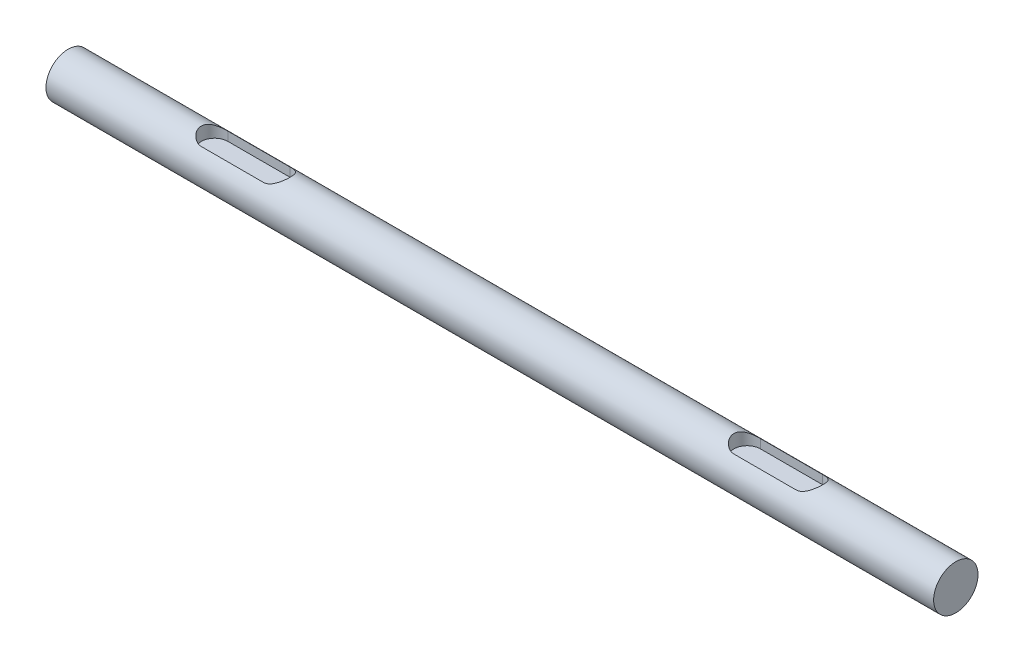
ISO-10303-21;
HEADER;
FILE_DESCRIPTION(('STEP AP214'),'2;1');
FILE_NAME('part.step','',(''),(''),'','','');
FILE_SCHEMA(('AUTOMOTIVE_DESIGN { 1 0 10303 214 1 1 1 1 }'));
ENDSEC;
DATA;
#1=APPLICATION_CONTEXT('core data for automotive mechanical design processes');
#2=APPLICATION_PROTOCOL_DEFINITION('international standard','automotive_design',2000,#1);
#3=PRODUCT_CONTEXT('',#1,'mechanical');
#4=PRODUCT('Part','Part','',(#3));
#5=PRODUCT_RELATED_PRODUCT_CATEGORY('part','',(#4));
#6=PRODUCT_DEFINITION_FORMATION('','',#4);
#7=PRODUCT_DEFINITION_CONTEXT('part definition',#1,'design');
#8=PRODUCT_DEFINITION('design','',#6,#7);
#9=PRODUCT_DEFINITION_SHAPE('','',#8);
#10=(LENGTH_UNIT() NAMED_UNIT(*) SI_UNIT(.MILLI.,.METRE.));
#11=(NAMED_UNIT(*) PLANE_ANGLE_UNIT() SI_UNIT($,.RADIAN.));
#12=(NAMED_UNIT(*) SI_UNIT($,.STERADIAN.) SOLID_ANGLE_UNIT());
#13=UNCERTAINTY_MEASURE_WITH_UNIT(LENGTH_MEASURE(1.E-05),#10,'distance_accuracy_value','');
#14=(GEOMETRIC_REPRESENTATION_CONTEXT(3) GLOBAL_UNCERTAINTY_ASSIGNED_CONTEXT((#13)) GLOBAL_UNIT_ASSIGNED_CONTEXT((#10,
#11,#12)) REPRESENTATION_CONTEXT('',''));
#15=CARTESIAN_POINT('',(0.,0.,0.));
#16=DIRECTION('',(0.,0.,1.));
#17=DIRECTION('',(1.,0.,0.));
#18=AXIS2_PLACEMENT_3D('',#15,#16,#17);
#19=CARTESIAN_POINT('',(100.,0.,0.));
#20=DIRECTION('',(-1.,0.,0.));
#21=DIRECTION('',(0.,0.,1.));
#22=AXIS2_PLACEMENT_3D('',#19,#20,#21);
#23=CYLINDRICAL_SURFACE('',#22,5.);
#24=DIRECTION('',(-1.,0.,0.));
#25=VECTOR('',#24,1.);
#26=CARTESIAN_POINT('',(100.,4.,-3.));
#27=LINE('',#26,#25);
#28=CARTESIAN_POINT('',(153.,4.,-3.));
#29=VERTEX_POINT('',#28);
#30=CARTESIAN_POINT('',(167.,4.,-3.));
#31=VERTEX_POINT('',#30);
#32=EDGE_CURVE('E11',#29,#31,#27,.F.);
#33=ORIENTED_EDGE('',*,*,#32,.T.);
#34=CARTESIAN_POINT('',(167.,4.,-3.));
#35=CARTESIAN_POINT('',(167.075871977817,3.99996787232582,-3.00001692537307));
#36=CARTESIAN_POINT('',(167.151725077901,4.00215786299425,-2.99712241547426));
#37=CARTESIAN_POINT('',(167.302688776043,4.01073748214672,-2.98564518053647));
#38=CARTESIAN_POINT('',(167.377800025514,4.01712301686455,-2.97706800024637));
#39=CARTESIAN_POINT('',(167.526129669188,4.03378307190143,-2.95445046977405));
#40=CARTESIAN_POINT('',(167.599358401018,4.04402606066036,-2.94045438932729));
#41=CARTESIAN_POINT('',(167.744028472743,4.06798283405872,-2.90722136348392));
#42=CARTESIAN_POINT('',(167.815469450417,4.0816973159079,-2.88798336524856));
#43=CARTESIAN_POINT('',(168.025929700044,4.12720949885208,-2.82293145826831));
#44=CARTESIAN_POINT('',(168.161761179177,4.16345930010657,-2.76967363516868));
#45=CARTESIAN_POINT('',(168.422652508669,4.24363256758644,-2.64519536397735));
#46=CARTESIAN_POINT('',(168.547687033726,4.28757338079437,-2.57393414481209));
#47=CARTESIAN_POINT('',(168.799917073737,4.38458187114304,-2.40540739276783));
#48=CARTESIAN_POINT('',(168.925532839025,4.43810998768875,-2.30603538494308));
#49=CARTESIAN_POINT('',(169.159570971129,4.54454402644165,-2.08849836637958));
#50=CARTESIAN_POINT('',(169.267987155479,4.59744971861747,-1.97032662842434));
#51=CARTESIAN_POINT('',(169.476278477957,4.70351635584216,-1.70284992270619));
#52=CARTESIAN_POINT('',(169.573960722109,4.75608571502877,-1.55155989155465));
#53=CARTESIAN_POINT('',(169.699741060205,4.82570253754456,-1.31133584893004));
#54=CARTESIAN_POINT('',(169.738220009195,4.84737427703644,-1.22901675253548));
#55=CARTESIAN_POINT('',(169.807789197253,4.8870090175708,-1.06047705712918));
#56=CARTESIAN_POINT('',(169.838884323908,4.90497447088308,-0.97425908416188));
#57=CARTESIAN_POINT('',(169.890627441134,4.93511192382809,-0.806968111144921));
#58=CARTESIAN_POINT('',(169.911987226586,4.94767213737429,-0.726184333286257));
#59=CARTESIAN_POINT('',(169.947949890093,4.96892319630847,-0.562666702523373));
#60=CARTESIAN_POINT('',(169.962556533415,4.97761619778881,-0.47993396338821));
#61=CARTESIAN_POINT('',(169.98478464018,4.99087752212245,-0.313245067395166));
#62=CARTESIAN_POINT('',(169.992409816133,4.99544803715671,-0.229289584910372));
#63=CARTESIAN_POINT('',(170.000566639965,5.00033941568446,-0.0609399693770785));
#64=CARTESIAN_POINT('',(170.001099009538,5.00066071153612,0.0234541181691588));
#65=CARTESIAN_POINT('',(169.992757198311,4.99565269254161,0.255171482719188));
#66=CARTESIAN_POINT('',(169.976528740899,4.98590474727508,0.402220564293291));
#67=CARTESIAN_POINT('',(169.923044400639,4.95416382666838,0.690956802633995));
#68=CARTESIAN_POINT('',(169.885787045797,4.93216999413411,0.832643583305859));
#69=CARTESIAN_POINT('',(169.791666925357,4.87769664946882,1.10810810538676));
#70=CARTESIAN_POINT('',(169.73469132452,4.8451568590039,1.24183502003438));
#71=CARTESIAN_POINT('',(169.603229553725,4.77219201218867,1.49798262201563));
#72=CARTESIAN_POINT('',(169.528739335702,4.73176513330436,1.62040068646818));
#73=CARTESIAN_POINT('',(169.354330852636,4.64076401053393,1.86613229963391));
#74=CARTESIAN_POINT('',(169.252439060816,4.58955455185811,1.98780984018437));
#75=CARTESIAN_POINT('',(169.031232566685,4.4851268486321,2.21339922400098));
#76=CARTESIAN_POINT('',(168.911889920185,4.43190548570084,2.31728198187349));
#77=CARTESIAN_POINT('',(168.642532023949,4.322164352034,2.51659971990669));
#78=CARTESIAN_POINT('',(168.490562671568,4.26598422797724,2.60963495464279));
#79=CARTESIAN_POINT('',(168.250228852194,4.1901448347924,2.72853585268934));
#80=CARTESIAN_POINT('',(168.168139587669,4.16628916905458,2.76470247721434));
#81=CARTESIAN_POINT('',(168.000188799264,4.12235655723054,2.82979053218025));
#82=CARTESIAN_POINT('',(167.914330437192,4.10227651585107,2.85871790392669));
#83=CARTESIAN_POINT('',(167.760808411581,4.07119612829703,2.90274028553152));
#84=CARTESIAN_POINT('',(167.693819454351,4.05917589940332,2.91948814079959));
#85=CARTESIAN_POINT('',(167.558393194759,4.03823334849025,2.94838741026761));
#86=CARTESIAN_POINT('',(167.489956377868,4.02931000501335,2.96054034014788));
#87=CARTESIAN_POINT('',(167.351576219637,4.01482929660031,2.98015179379349));
#88=CARTESIAN_POINT('',(167.281625795797,4.00929524901473,2.98757781123641));
#89=CARTESIAN_POINT('',(167.14112148518,4.00186666189432,2.99751072442895));
#90=CARTESIAN_POINT('',(167.070567101116,3.99997548544344,3.00001307471461));
#91=CARTESIAN_POINT('',(167.,4.,3.));
#92=B_SPLINE_CURVE_WITH_KNOTS('',3,(#34,#35,#36,#37,#38,#39,#40,#41,#42,#43,#44,#45,#46,#47,#48,
#49,#50,#51,#52,#53,#54,#55,#56,#57,#58,#59,#60,#61,#62,#63,#64,#65,#66,#67,#68,#69,#70,#71,#72,
#73,#74,#75,#76,#77,#78,#79,#80,#81,#82,#83,#84,#85,#86,#87,#88,#89,#90,#91),.UNSPECIFIED.,.F.,
.F.,(4,2,2,2,2,2,2,2,2,2,2,2,2,2,2,2,2,2,2,2,2,2,2,2,2,2,2,2,4),(0.,0.227498555850956,
0.454775460929315,0.680233524310966,0.905736904347167,1.35470516337815,1.80469943008075,
2.30931246709202,2.81410648055543,3.3735112951261,3.65339988736763,3.93310269272289,
4.18623678333959,4.43922956632183,4.69208773794771,4.94492018104927,5.38737462629133,
5.82986004658814,6.27492058766906,6.7200840946005,7.2183638704073,7.7174504652549,
8.27476706024813,8.55288821458628,8.83078035880876,9.04083694509353,9.25082418161798,
9.46224029964897,9.67385150282048),.UNSPECIFIED.);
#93=CARTESIAN_POINT('',(167.,4.,3.));
#94=VERTEX_POINT('',#93);
#95=EDGE_CURVE('E249',#31,#94,#92,.T.);
#96=ORIENTED_EDGE('',*,*,#95,.T.);
#97=DIRECTION('',(-1.,0.,0.));
#98=VECTOR('',#97,1.);
#99=CARTESIAN_POINT('',(100.,4.,3.));
#100=LINE('',#99,#98);
#101=CARTESIAN_POINT('',(153.,4.,3.));
#102=VERTEX_POINT('',#101);
#103=EDGE_CURVE('E52',#94,#102,#100,.T.);
#104=ORIENTED_EDGE('',*,*,#103,.T.);
#105=CARTESIAN_POINT('',(153.,4.,3.));
#106=CARTESIAN_POINT('',(152.924128022183,3.99996787232582,3.00001692537307));
#107=CARTESIAN_POINT('',(152.848274922099,4.00215786299426,2.99712241547426));
#108=CARTESIAN_POINT('',(152.697311223957,4.01073748214673,2.98564518053647));
#109=CARTESIAN_POINT('',(152.622199974486,4.01712301686455,2.97706800024636));
#110=CARTESIAN_POINT('',(152.473870330812,4.03378307190143,2.95445046977405));
#111=CARTESIAN_POINT('',(152.400641598982,4.04402606066036,2.9404543893273));
#112=CARTESIAN_POINT('',(152.255971527257,4.06798283405872,2.90722136348392));
#113=CARTESIAN_POINT('',(152.184530549583,4.0816973159079,2.88798336524856));
#114=CARTESIAN_POINT('',(151.974070299956,4.12720949885208,2.8229314582683));
#115=CARTESIAN_POINT('',(151.838238820823,4.16345930010658,2.76967363516867));
#116=CARTESIAN_POINT('',(151.577347491331,4.24363256758645,2.64519536397734));
#117=CARTESIAN_POINT('',(151.452312966274,4.28757338079437,2.57393414481208));
#118=CARTESIAN_POINT('',(151.200082926263,4.38458187114304,2.40540739276782));
#119=CARTESIAN_POINT('',(151.074467160975,4.43810998768876,2.30603538494308));
#120=CARTESIAN_POINT('',(150.840429028871,4.54454402644165,2.08849836637957));
#121=CARTESIAN_POINT('',(150.732012844521,4.59744971861747,1.97032662842434));
#122=CARTESIAN_POINT('',(150.523721522043,4.70351635584216,1.70284992270619));
#123=CARTESIAN_POINT('',(150.426039277891,4.75608571502877,1.55155989155465));
#124=CARTESIAN_POINT('',(150.300258939795,4.82570253754456,1.31133584893005));
#125=CARTESIAN_POINT('',(150.261779990805,4.84737427703644,1.22901675253549));
#126=CARTESIAN_POINT('',(150.192210802747,4.8870090175708,1.06047705712919));
#127=CARTESIAN_POINT('',(150.161115676092,4.90497447088308,0.974259084161883));
#128=CARTESIAN_POINT('',(150.109372558866,4.93511192382809,0.806968111144922));
#129=CARTESIAN_POINT('',(150.088012773414,4.94767213737429,0.72618433328626));
#130=CARTESIAN_POINT('',(150.052050109907,4.96892319630847,0.562666702523376));
#131=CARTESIAN_POINT('',(150.037443466585,4.97761619778881,0.479933963388211));
#132=CARTESIAN_POINT('',(150.01521535982,4.99087752212245,0.313245067395167));
#133=CARTESIAN_POINT('',(150.007590183867,4.99544803715671,0.229289584910374));
#134=CARTESIAN_POINT('',(149.999433360035,5.00033941568446,0.060939969377081));
#135=CARTESIAN_POINT('',(149.998900990462,5.00066071153612,-0.0234541181691576));
#136=CARTESIAN_POINT('',(150.007242801689,4.9956526925416,-0.25517148271919));
#137=CARTESIAN_POINT('',(150.023471259101,4.98590474727508,-0.402220564293295));
#138=CARTESIAN_POINT('',(150.076955599361,4.95416382666838,-0.690956802633998));
#139=CARTESIAN_POINT('',(150.114212954203,4.93216999413411,-0.832643583305861));
#140=CARTESIAN_POINT('',(150.208333074643,4.87769664946882,-1.10810810538676));
#141=CARTESIAN_POINT('',(150.26530867548,4.8451568590039,-1.24183502003437));
#142=CARTESIAN_POINT('',(150.396770446275,4.77219201218867,-1.49798262201562));
#143=CARTESIAN_POINT('',(150.471260664298,4.73176513330436,-1.62040068646818));
#144=CARTESIAN_POINT('',(150.645669147364,4.64076401053392,-1.86613229963392));
#145=CARTESIAN_POINT('',(150.747560939184,4.5895545518581,-1.98780984018438));
#146=CARTESIAN_POINT('',(150.968767433315,4.48512684863209,-2.21339922400099));
#147=CARTESIAN_POINT('',(151.088110079815,4.43190548570084,-2.31728198187349));
#148=CARTESIAN_POINT('',(151.357467976051,4.322164352034,-2.5165997199067));
#149=CARTESIAN_POINT('',(151.509437328432,4.26598422797724,-2.60963495464279));
#150=CARTESIAN_POINT('',(151.749771147806,4.1901448347924,-2.72853585268934));
#151=CARTESIAN_POINT('',(151.831860412331,4.16628916905457,-2.76470247721434));
#152=CARTESIAN_POINT('',(151.999811200736,4.12235655723054,-2.82979053218025));
#153=CARTESIAN_POINT('',(152.085669562808,4.10227651585107,-2.85871790392669));
#154=CARTESIAN_POINT('',(152.239191588419,4.07119612829704,-2.90274028553151));
#155=CARTESIAN_POINT('',(152.306180545649,4.05917589940332,-2.91948814079957));
#156=CARTESIAN_POINT('',(152.441606805241,4.03823334849026,-2.9483874102676));
#157=CARTESIAN_POINT('',(152.510043622132,4.02931000501335,-2.96054034014788));
#158=CARTESIAN_POINT('',(152.648423780363,4.01482929660031,-2.98015179379349));
#159=CARTESIAN_POINT('',(152.718374204203,4.00929524901473,-2.98757781123641));
#160=CARTESIAN_POINT('',(152.85887851482,4.00186666189432,-2.99751072442895));
#161=CARTESIAN_POINT('',(152.929432898884,3.99997548544344,-3.00001307471461));
#162=CARTESIAN_POINT('',(153.,4.,-3.));
#163=B_SPLINE_CURVE_WITH_KNOTS('',3,(#105,#106,#107,#108,#109,#110,#111,#112,#113,#114,#115,
#116,#117,#118,#119,#120,#121,#122,#123,#124,#125,#126,#127,#128,#129,#130,#131,#132,#133,#134,
#135,#136,#137,#138,#139,#140,#141,#142,#143,#144,#145,#146,#147,#148,#149,#150,#151,#152,#153,
#154,#155,#156,#157,#158,#159,#160,#161,#162),.UNSPECIFIED.,.F.,.F.,(4,2,2,2,2,2,2,2,2,2,2,2,2,
2,2,2,2,2,2,2,2,2,2,2,2,2,2,2,4),(0.,0.227498555850984,0.454775460929315,0.680233524310937,
0.905736904347166,1.35470516337824,1.80469943008075,2.30931246709202,2.81410648055543,
3.3735112951261,3.65339988736762,3.93310269272289,4.18623678333959,4.43922956632184,
4.69208773794771,4.94492018104927,5.38737462629133,5.82986004658814,6.27492058766905,
6.7200840946005,7.21836387040733,7.71745046525489,8.27476706024813,8.55288821458631,
8.83078035880876,9.04083694509344,9.25082418161798,9.46224029964895,9.67385150282049),.UNSPECIFIED.);
#164=EDGE_CURVE('E59',#102,#29,#163,.T.);
#165=ORIENTED_EDGE('',*,*,#164,.T.);
#166=EDGE_LOOP('',(#33,#96,#104,#165));
#167=FACE_BOUND('',#166,.T.);
#168=DIRECTION('',(-1.,0.,0.));
#169=VECTOR('',#168,1.);
#170=CARTESIAN_POINT('',(100.,4.,-3.));
#171=LINE('',#170,#169);
#172=CARTESIAN_POINT('',(33.,4.,-3.));
#173=VERTEX_POINT('',#172);
#174=CARTESIAN_POINT('',(47.,4.,-3.));
#175=VERTEX_POINT('',#174);
#176=EDGE_CURVE('E376',#173,#175,#171,.F.);
#177=ORIENTED_EDGE('',*,*,#176,.T.);
#178=CARTESIAN_POINT('',(47.,4.,-3.));
#179=CARTESIAN_POINT('',(47.0758719778166,3.99996787232582,-3.00001692537307));
#180=CARTESIAN_POINT('',(47.1517250779009,4.00215786299425,-2.99712241547426));
#181=CARTESIAN_POINT('',(47.3026887760434,4.01073748214673,-2.98564518053647));
#182=CARTESIAN_POINT('',(47.3778000255142,4.01712301686455,-2.97706800024636));
#183=CARTESIAN_POINT('',(47.5261296691882,4.03378307190143,-2.95445046977405));
#184=CARTESIAN_POINT('',(47.5993584010179,4.04402606066036,-2.9404543893273));
#185=CARTESIAN_POINT('',(47.7440284727426,4.06798283405873,-2.90722136348392));
#186=CARTESIAN_POINT('',(47.8154694504168,4.0816973159079,-2.88798336524856));
#187=CARTESIAN_POINT('',(48.0259297000444,4.12720949885208,-2.8229314582683));
#188=CARTESIAN_POINT('',(48.1617611791772,4.16345930010658,-2.76967363516867));
#189=CARTESIAN_POINT('',(48.4226525086688,4.24363256758645,-2.64519536397734));
#190=CARTESIAN_POINT('',(48.547687033726,4.28757338079438,-2.57393414481208));
#191=CARTESIAN_POINT('',(48.7999170737373,4.38458187114305,-2.40540739276781));
#192=CARTESIAN_POINT('',(48.9255328390247,4.43810998768876,-2.30603538494307));
#193=CARTESIAN_POINT('',(49.1595709711291,4.54454402644166,-2.08849836637956));
#194=CARTESIAN_POINT('',(49.2679871554789,4.59744971861748,-1.97032662842432));
#195=CARTESIAN_POINT('',(49.4762784779573,4.70351635584217,-1.70284992270617));
#196=CARTESIAN_POINT('',(49.5739607221093,4.75608571502877,-1.55155989155464));
#197=CARTESIAN_POINT('',(49.6997410602051,4.82570253754456,-1.31133584893003));
#198=CARTESIAN_POINT('',(49.7382200091952,4.84737427703644,-1.22901675253547));
#199=CARTESIAN_POINT('',(49.8077891972526,4.88700901757081,-1.06047705712917));
#200=CARTESIAN_POINT('',(49.8388843239077,4.90497447088308,-0.974259084161878));
#201=CARTESIAN_POINT('',(49.8906274411337,4.93511192382809,-0.806968111144922));
#202=CARTESIAN_POINT('',(49.9119872265863,4.94767213737429,-0.726184333286257));
#203=CARTESIAN_POINT('',(49.9479498900931,4.96892319630847,-0.562666702523371));
#204=CARTESIAN_POINT('',(49.9625565334154,4.97761619778881,-0.479933963388208));
#205=CARTESIAN_POINT('',(49.9847846401799,4.99087752212245,-0.313245067395162));
#206=CARTESIAN_POINT('',(49.9924098161327,4.99544803715671,-0.229289584910366));
#207=CARTESIAN_POINT('',(50.0005666399651,5.00033941568446,-0.0609399693770693));
#208=CARTESIAN_POINT('',(50.001099009538,5.00066071153612,0.0234541181691695));
#209=CARTESIAN_POINT('',(49.9927571983106,4.99565269254161,0.2551714827192));
#210=CARTESIAN_POINT('',(49.976528740899,4.98590474727508,0.402220564293303));
#211=CARTESIAN_POINT('',(49.9230444006393,4.95416382666838,0.690956802634007));
#212=CARTESIAN_POINT('',(49.8857870457968,4.93216999413411,0.832643583305873));
#213=CARTESIAN_POINT('',(49.791666925357,4.87769664946882,1.10810810538677));
#214=CARTESIAN_POINT('',(49.73469132452,4.8451568590039,1.24183502003439));
#215=CARTESIAN_POINT('',(49.6032295537245,4.77219201218867,1.49798262201563));
#216=CARTESIAN_POINT('',(49.5287393357024,4.73176513330436,1.62040068646819));
#217=CARTESIAN_POINT('',(49.3543308526364,4.64076401053392,1.86613229963392));
#218=CARTESIAN_POINT('',(49.2524390608162,4.5895545518581,1.98780984018438));
#219=CARTESIAN_POINT('',(49.0312325666845,4.48512684863209,2.21339922400099));
#220=CARTESIAN_POINT('',(48.9118899201853,4.43190548570084,2.31728198187349));
#221=CARTESIAN_POINT('',(48.6425320239493,4.322164352034,2.51659971990669));
#222=CARTESIAN_POINT('',(48.4905626715682,4.26598422797724,2.60963495464279));
#223=CARTESIAN_POINT('',(48.2502288521944,4.1901448347924,2.72853585268935));
#224=CARTESIAN_POINT('',(48.1681395876686,4.16628916905457,2.76470247721435));
#225=CARTESIAN_POINT('',(48.0001887992641,4.12235655723053,2.82979053218026));
#226=CARTESIAN_POINT('',(47.9143304371918,4.10227651585106,2.8587179039267));
#227=CARTESIAN_POINT('',(47.7608084115808,4.07119612829703,2.90274028553152));
#228=CARTESIAN_POINT('',(47.6938194543507,4.05917589940332,2.91948814079958));
#229=CARTESIAN_POINT('',(47.5583931947592,4.03823334849025,2.94838741026761));
#230=CARTESIAN_POINT('',(47.4899563778677,4.02931000501334,2.96054034014789));
#231=CARTESIAN_POINT('',(47.3515762196373,4.0148292966003,2.9801517937935));
#232=CARTESIAN_POINT('',(47.2816257957969,4.00929524901473,2.98757781123641));
#233=CARTESIAN_POINT('',(47.1411214851798,4.00186666189432,2.99751072442895));
#234=CARTESIAN_POINT('',(47.0705671011161,3.99997548544344,3.00001307471461));
#235=CARTESIAN_POINT('',(47.,4.,3.));
#236=B_SPLINE_CURVE_WITH_KNOTS('',3,(#178,#179,#180,#181,#182,#183,#184,#185,#186,#187,#188,
#189,#190,#191,#192,#193,#194,#195,#196,#197,#198,#199,#200,#201,#202,#203,#204,#205,#206,#207,
#208,#209,#210,#211,#212,#213,#214,#215,#216,#217,#218,#219,#220,#221,#222,#223,#224,#225,#226,
#227,#228,#229,#230,#231,#232,#233,#234,#235),.UNSPECIFIED.,.F.,.F.,(4,2,2,2,2,2,2,2,2,2,2,2,2,
2,2,2,2,2,2,2,2,2,2,2,2,2,2,2,4),(0.,0.227498555850963,0.454775460929301,0.680233524310973,
0.905736904347181,1.35470516337821,1.80469943008078,2.30931246709203,2.81410648055544,
3.37351129512612,3.65339988736764,3.93310269272289,4.18623678333959,4.43922956632184,
4.69208773794772,4.94492018104929,5.38737462629134,5.82986004658815,6.27492058766907,
6.7200840946005,7.21836387040733,7.71745046525489,8.27476706024814,8.55288821458632,
8.83078035880877,9.04083694509352,9.25082418161801,9.46224029964901,9.67385150282051),.UNSPECIFIED.);
#237=CARTESIAN_POINT('',(47.,4.,3.));
#238=VERTEX_POINT('',#237);
#239=EDGE_CURVE('E187',#175,#238,#236,.T.);
#240=ORIENTED_EDGE('',*,*,#239,.T.);
#241=DIRECTION('',(-1.,0.,0.));
#242=VECTOR('',#241,1.);
#243=CARTESIAN_POINT('',(100.,4.,3.));
#244=LINE('',#243,#242);
#245=CARTESIAN_POINT('',(33.,4.,3.));
#246=VERTEX_POINT('',#245);
#247=EDGE_CURVE('E381',#238,#246,#244,.T.);
#248=ORIENTED_EDGE('',*,*,#247,.T.);
#249=CARTESIAN_POINT('',(33.,4.,3.));
#250=CARTESIAN_POINT('',(32.9241280221834,3.99996787232582,3.00001692537307));
#251=CARTESIAN_POINT('',(32.8482749220991,4.00215786299425,2.99712241547426));
#252=CARTESIAN_POINT('',(32.6973112239566,4.01073748214673,2.98564518053647));
#253=CARTESIAN_POINT('',(32.6221999744858,4.01712301686455,2.97706800024636));
#254=CARTESIAN_POINT('',(32.4738703308118,4.03378307190143,2.95445046977405));
#255=CARTESIAN_POINT('',(32.4006415989821,4.04402606066036,2.94045438932729));
#256=CARTESIAN_POINT('',(32.2559715272574,4.06798283405872,2.90722136348392));
#257=CARTESIAN_POINT('',(32.1845305495832,4.0816973159079,2.88798336524856));
#258=CARTESIAN_POINT('',(31.9740702999556,4.12720949885209,2.8229314582683));
#259=CARTESIAN_POINT('',(31.8382388208228,4.16345930010658,2.76967363516867));
#260=CARTESIAN_POINT('',(31.5773474913312,4.24363256758645,2.64519536397734));
#261=CARTESIAN_POINT('',(31.452312966274,4.28757338079438,2.57393414481208));
#262=CARTESIAN_POINT('',(31.2000829262627,4.38458187114305,2.40540739276782));
#263=CARTESIAN_POINT('',(31.0744671609752,4.43810998768876,2.30603538494307));
#264=CARTESIAN_POINT('',(30.8404290288709,4.54454402644166,2.08849836637957));
#265=CARTESIAN_POINT('',(30.7320128445211,4.59744971861748,1.97032662842432));
#266=CARTESIAN_POINT('',(30.5237215220427,4.70351635584217,1.70284992270617));
#267=CARTESIAN_POINT('',(30.4260392778907,4.75608571502877,1.55155989155464));
#268=CARTESIAN_POINT('',(30.3002589397949,4.82570253754456,1.31133584893003));
#269=CARTESIAN_POINT('',(30.2617799908048,4.84737427703644,1.22901675253547));
#270=CARTESIAN_POINT('',(30.1922108027474,4.88700901757081,1.06047705712918));
#271=CARTESIAN_POINT('',(30.1611156760923,4.90497447088308,0.974259084161879));
#272=CARTESIAN_POINT('',(30.1093725588663,4.93511192382809,0.80696811114492));
#273=CARTESIAN_POINT('',(30.0880127734137,4.94767213737429,0.726184333286255));
#274=CARTESIAN_POINT('',(30.0520501099069,4.96892319630847,0.562666702523369));
#275=CARTESIAN_POINT('',(30.0374434665847,4.97761619778881,0.479933963388205));
#276=CARTESIAN_POINT('',(30.0152153598201,4.99087752212245,0.313245067395159));
#277=CARTESIAN_POINT('',(30.0075901838673,4.99544803715671,0.229289584910363));
#278=CARTESIAN_POINT('',(29.9994333600349,5.00033941568446,0.0609399693770667));
#279=CARTESIAN_POINT('',(29.998900990462,5.00066071153612,-0.0234541181691722));
#280=CARTESIAN_POINT('',(30.0072428016894,4.9956526925416,-0.255171482719202));
#281=CARTESIAN_POINT('',(30.023471259101,4.98590474727508,-0.402220564293305));
#282=CARTESIAN_POINT('',(30.0769555993607,4.95416382666838,-0.690956802634009));
#283=CARTESIAN_POINT('',(30.1142129542032,4.93216999413411,-0.832643583305875));
#284=CARTESIAN_POINT('',(30.208333074643,4.87769664946882,-1.10810810538677));
#285=CARTESIAN_POINT('',(30.26530867548,4.8451568590039,-1.24183502003439));
#286=CARTESIAN_POINT('',(30.3967704462755,4.77219201218866,-1.49798262201563));
#287=CARTESIAN_POINT('',(30.4712606642976,4.73176513330436,-1.62040068646819));
#288=CARTESIAN_POINT('',(30.6456691473636,4.64076401053392,-1.86613229963392));
#289=CARTESIAN_POINT('',(30.7475609391838,4.5895545518581,-1.98780984018438));
#290=CARTESIAN_POINT('',(30.9687674333155,4.48512684863209,-2.21339922400098));
#291=CARTESIAN_POINT('',(31.0881100798147,4.43190548570084,-2.31728198187349));
#292=CARTESIAN_POINT('',(31.3574679760507,4.322164352034,-2.5165997199067));
#293=CARTESIAN_POINT('',(31.5094373284318,4.26598422797724,-2.60963495464279));
#294=CARTESIAN_POINT('',(31.7497711478056,4.1901448347924,-2.72853585268934));
#295=CARTESIAN_POINT('',(31.8318604123314,4.16628916905457,-2.76470247721434));
#296=CARTESIAN_POINT('',(31.9998112007359,4.12235655723053,-2.82979053218025));
#297=CARTESIAN_POINT('',(32.0856695628082,4.10227651585106,-2.8587179039267));
#298=CARTESIAN_POINT('',(32.2391915884192,4.07119612829703,-2.90274028553152));
#299=CARTESIAN_POINT('',(32.3061805456493,4.05917589940332,-2.91948814079958));
#300=CARTESIAN_POINT('',(32.4416068052408,4.03823334849025,-2.94838741026761));
#301=CARTESIAN_POINT('',(32.5100436221323,4.02931000501334,-2.96054034014789));
#302=CARTESIAN_POINT('',(32.6484237803627,4.0148292966003,-2.9801517937935));
#303=CARTESIAN_POINT('',(32.7183742042031,4.00929524901473,-2.98757781123641));
#304=CARTESIAN_POINT('',(32.8588785148202,4.00186666189432,-2.99751072442895));
#305=CARTESIAN_POINT('',(32.9294328988839,3.99997548544344,-3.00001307471461));
#306=CARTESIAN_POINT('',(33.,4.,-3.));
#307=B_SPLINE_CURVE_WITH_KNOTS('',3,(#249,#250,#251,#252,#253,#254,#255,#256,#257,#258,#259,
#260,#261,#262,#263,#264,#265,#266,#267,#268,#269,#270,#271,#272,#273,#274,#275,#276,#277,#278,
#279,#280,#281,#282,#283,#284,#285,#286,#287,#288,#289,#290,#291,#292,#293,#294,#295,#296,#297,
#298,#299,#300,#301,#302,#303,#304,#305,#306),.UNSPECIFIED.,.F.,.F.,(4,2,2,2,2,2,2,2,2,2,2,2,2,
2,2,2,2,2,2,2,2,2,2,2,2,2,2,2,4),(0.,0.227498555850963,0.454775460929308,0.68023352431098,
0.905736904347181,1.35470516337821,1.80469943008078,2.30931246709203,2.81410648055544,
3.37351129512612,3.65339988736764,3.93310269272289,4.18623678333959,4.43922956632184,
4.69208773794773,4.94492018104929,5.38737462629134,5.82986004658815,6.27492058766907,
6.7200840946005,7.21836387040733,7.71745046525489,8.27476706024814,8.5528882145863,
8.83078035880877,9.04083694509352,9.25082418161801,9.46224029964901,9.67385150282052),.UNSPECIFIED.);
#308=EDGE_CURVE('E67',#246,#173,#307,.T.);
#309=ORIENTED_EDGE('',*,*,#308,.T.);
#310=EDGE_LOOP('',(#177,#240,#248,#309));
#311=FACE_BOUND('',#310,.T.);
#312=CARTESIAN_POINT('',(0.,0.,0.));
#313=DIRECTION('',(1.,0.,0.));
#314=DIRECTION('',(0.,0.,-1.));
#315=AXIS2_PLACEMENT_3D('',#312,#313,#314);
#316=CIRCLE('',#315,5.);
#317=CARTESIAN_POINT('',(0.,0.,-5.));
#318=VERTEX_POINT('',#317);
#319=EDGE_CURVE('E173',#318,#318,#316,.T.);
#320=ORIENTED_EDGE('',*,*,#319,.T.);
#321=EDGE_LOOP('',(#320));
#322=FACE_BOUND('',#321,.T.);
#323=CARTESIAN_POINT('',(200.,0.,0.));
#324=DIRECTION('',(1.,0.,0.));
#325=DIRECTION('',(0.,0.,-1.));
#326=AXIS2_PLACEMENT_3D('',#323,#324,#325);
#327=CIRCLE('',#326,5.);
#328=CARTESIAN_POINT('',(200.,0.,-5.));
#329=VERTEX_POINT('',#328);
#330=EDGE_CURVE('E143',#329,#329,#327,.T.);
#331=ORIENTED_EDGE('',*,*,#330,.F.);
#332=EDGE_LOOP('',(#331));
#333=FACE_BOUND('',#332,.T.);
#334=ADVANCED_FACE('F43',(#167,#311,#322,#333),#23,.T.);
#335=CARTESIAN_POINT('',(0.,0.,0.));
#336=DIRECTION('',(1.,0.,0.));
#337=DIRECTION('',(0.,0.,-1.));
#338=AXIS2_PLACEMENT_3D('',#335,#336,#337);
#339=PLANE('',#338);
#340=ORIENTED_EDGE('',*,*,#319,.F.);
#341=EDGE_LOOP('',(#340));
#342=FACE_BOUND('',#341,.T.);
#343=ADVANCED_FACE('F217',(#342),#339,.F.);
#344=CARTESIAN_POINT('',(33.,2.,0.));
#345=DIRECTION('',(0.,1.,0.));
#346=DIRECTION('',(0.,0.,1.));
#347=AXIS2_PLACEMENT_3D('',#344,#345,#346);
#348=CYLINDRICAL_SURFACE('',#347,3.);
#349=DIRECTION('',(0.,1.,0.));
#350=VECTOR('',#349,1.);
#351=CARTESIAN_POINT('',(33.,2.,3.));
#352=LINE('',#351,#350);
#353=CARTESIAN_POINT('',(33.,2.,3.));
#354=VERTEX_POINT('',#353);
#355=EDGE_CURVE('E169',#354,#246,#352,.T.);
#356=ORIENTED_EDGE('',*,*,#355,.F.);
#357=CARTESIAN_POINT('',(33.,2.,0.));
#358=DIRECTION('',(0.,1.,0.));
#359=DIRECTION('',(0.,0.,1.));
#360=AXIS2_PLACEMENT_3D('',#357,#358,#359);
#361=CIRCLE('',#360,3.);
#362=CARTESIAN_POINT('',(33.,2.,-3.));
#363=VERTEX_POINT('',#362);
#364=EDGE_CURVE('E153',#363,#354,#361,.T.);
#365=ORIENTED_EDGE('',*,*,#364,.F.);
#366=DIRECTION('',(0.,1.,0.));
#367=VECTOR('',#366,1.);
#368=CARTESIAN_POINT('',(33.,2.,-3.));
#369=LINE('',#368,#367);
#370=EDGE_CURVE('E170',#363,#173,#369,.T.);
#371=ORIENTED_EDGE('',*,*,#370,.T.);
#372=ORIENTED_EDGE('',*,*,#308,.F.);
#373=EDGE_LOOP('',(#356,#365,#371,#372));
#374=FACE_BOUND('',#373,.T.);
#375=ADVANCED_FACE('F214',(#374),#348,.F.);
#376=CARTESIAN_POINT('',(33.,2.,-3.));
#377=DIRECTION('',(0.,0.,-1.));
#378=DIRECTION('',(-1.,0.,0.));
#379=AXIS2_PLACEMENT_3D('',#376,#377,#378);
#380=PLANE('',#379);
#381=ORIENTED_EDGE('',*,*,#370,.F.);
#382=DIRECTION('',(-1.,0.,0.));
#383=VECTOR('',#382,1.);
#384=CARTESIAN_POINT('',(33.,2.,-3.));
#385=LINE('',#384,#383);
#386=CARTESIAN_POINT('',(47.,2.,-3.));
#387=VERTEX_POINT('',#386);
#388=EDGE_CURVE('E165',#387,#363,#385,.T.);
#389=ORIENTED_EDGE('',*,*,#388,.F.);
#390=DIRECTION('',(0.,1.,0.));
#391=VECTOR('',#390,1.);
#392=CARTESIAN_POINT('',(47.,2.,-3.));
#393=LINE('',#392,#391);
#394=EDGE_CURVE('E174',#387,#175,#393,.T.);
#395=ORIENTED_EDGE('',*,*,#394,.T.);
#396=ORIENTED_EDGE('',*,*,#176,.F.);
#397=EDGE_LOOP('',(#381,#389,#395,#396));
#398=FACE_BOUND('',#397,.T.);
#399=ADVANCED_FACE('F208',(#398),#380,.F.);
#400=CARTESIAN_POINT('',(47.,2.,0.));
#401=DIRECTION('',(0.,1.,0.));
#402=DIRECTION('',(0.,0.,1.));
#403=AXIS2_PLACEMENT_3D('',#400,#401,#402);
#404=CYLINDRICAL_SURFACE('',#403,3.);
#405=ORIENTED_EDGE('',*,*,#394,.F.);
#406=CARTESIAN_POINT('',(47.,2.,0.));
#407=DIRECTION('',(0.,1.,0.));
#408=DIRECTION('',(0.,0.,-1.));
#409=AXIS2_PLACEMENT_3D('',#406,#407,#408);
#410=CIRCLE('',#409,3.);
#411=CARTESIAN_POINT('',(47.,2.,3.));
#412=VERTEX_POINT('',#411);
#413=EDGE_CURVE('E161',#412,#387,#410,.T.);
#414=ORIENTED_EDGE('',*,*,#413,.F.);
#415=DIRECTION('',(0.,1.,0.));
#416=VECTOR('',#415,1.);
#417=CARTESIAN_POINT('',(47.,2.,3.));
#418=LINE('',#417,#416);
#419=EDGE_CURVE('E178',#412,#238,#418,.T.);
#420=ORIENTED_EDGE('',*,*,#419,.T.);
#421=ORIENTED_EDGE('',*,*,#239,.F.);
#422=EDGE_LOOP('',(#405,#414,#420,#421));
#423=FACE_BOUND('',#422,.T.);
#424=ADVANCED_FACE('F202',(#423),#404,.F.);
#425=CARTESIAN_POINT('',(33.,2.,3.));
#426=DIRECTION('',(0.,0.,1.));
#427=DIRECTION('',(1.,0.,0.));
#428=AXIS2_PLACEMENT_3D('',#425,#426,#427);
#429=PLANE('',#428);
#430=ORIENTED_EDGE('',*,*,#419,.F.);
#431=DIRECTION('',(1.,0.,0.));
#432=VECTOR('',#431,1.);
#433=CARTESIAN_POINT('',(33.,2.,3.));
#434=LINE('',#433,#432);
#435=EDGE_CURVE('E157',#354,#412,#434,.T.);
#436=ORIENTED_EDGE('',*,*,#435,.F.);
#437=ORIENTED_EDGE('',*,*,#355,.T.);
#438=ORIENTED_EDGE('',*,*,#247,.F.);
#439=EDGE_LOOP('',(#430,#436,#437,#438));
#440=FACE_BOUND('',#439,.T.);
#441=ADVANCED_FACE('F207',(#440),#429,.F.);
#442=CARTESIAN_POINT('',(33.,2.,0.));
#443=DIRECTION('',(0.,1.,0.));
#444=DIRECTION('',(0.,0.,1.));
#445=AXIS2_PLACEMENT_3D('',#442,#443,#444);
#446=PLANE('',#445);
#447=ORIENTED_EDGE('',*,*,#364,.T.);
#448=ORIENTED_EDGE('',*,*,#435,.T.);
#449=ORIENTED_EDGE('',*,*,#413,.T.);
#450=ORIENTED_EDGE('',*,*,#388,.T.);
#451=EDGE_LOOP('',(#447,#448,#449,#450));
#452=FACE_BOUND('',#451,.T.);
#453=ADVANCED_FACE('F212',(#452),#446,.T.);
#454=CARTESIAN_POINT('',(200.,0.,0.));
#455=DIRECTION('',(1.,0.,0.));
#456=DIRECTION('',(0.,0.,-1.));
#457=AXIS2_PLACEMENT_3D('',#454,#455,#456);
#458=PLANE('',#457);
#459=ORIENTED_EDGE('',*,*,#330,.T.);
#460=EDGE_LOOP('',(#459));
#461=FACE_BOUND('',#460,.T.);
#462=ADVANCED_FACE('F229',(#461),#458,.T.);
#463=CARTESIAN_POINT('',(153.,2.,0.));
#464=DIRECTION('',(0.,1.,0.));
#465=DIRECTION('',(0.,0.,1.));
#466=AXIS2_PLACEMENT_3D('',#463,#464,#465);
#467=CYLINDRICAL_SURFACE('',#466,3.);
#468=DIRECTION('',(0.,1.,0.));
#469=VECTOR('',#468,1.);
#470=CARTESIAN_POINT('',(153.,2.,3.));
#471=LINE('',#470,#469);
#472=CARTESIAN_POINT('',(153.,2.,3.));
#473=VERTEX_POINT('',#472);
#474=EDGE_CURVE('E109',#473,#102,#471,.T.);
#475=ORIENTED_EDGE('',*,*,#474,.F.);
#476=CARTESIAN_POINT('',(153.,2.,0.));
#477=DIRECTION('',(0.,1.,0.));
#478=DIRECTION('',(0.,0.,1.));
#479=AXIS2_PLACEMENT_3D('',#476,#477,#478);
#480=CIRCLE('',#479,3.);
#481=CARTESIAN_POINT('',(153.,2.,-3.));
#482=VERTEX_POINT('',#481);
#483=EDGE_CURVE('E113',#482,#473,#480,.T.);
#484=ORIENTED_EDGE('',*,*,#483,.F.);
#485=DIRECTION('',(0.,1.,0.));
#486=VECTOR('',#485,1.);
#487=CARTESIAN_POINT('',(153.,2.,-3.));
#488=LINE('',#487,#486);
#489=EDGE_CURVE('E140',#482,#29,#488,.T.);
#490=ORIENTED_EDGE('',*,*,#489,.T.);
#491=ORIENTED_EDGE('',*,*,#164,.F.);
#492=EDGE_LOOP('',(#475,#484,#490,#491));
#493=FACE_BOUND('',#492,.T.);
#494=ADVANCED_FACE('F111',(#493),#467,.F.);
#495=CARTESIAN_POINT('',(153.,2.,-3.));
#496=DIRECTION('',(0.,0.,-1.));
#497=DIRECTION('',(-1.,0.,0.));
#498=AXIS2_PLACEMENT_3D('',#495,#496,#497);
#499=PLANE('',#498);
#500=ORIENTED_EDGE('',*,*,#489,.F.);
#501=DIRECTION('',(-1.,0.,0.));
#502=VECTOR('',#501,1.);
#503=CARTESIAN_POINT('',(153.,2.,-3.));
#504=LINE('',#503,#502);
#505=CARTESIAN_POINT('',(167.,2.,-3.));
#506=VERTEX_POINT('',#505);
#507=EDGE_CURVE('E119',#506,#482,#504,.T.);
#508=ORIENTED_EDGE('',*,*,#507,.F.);
#509=DIRECTION('',(0.,1.,0.));
#510=VECTOR('',#509,1.);
#511=CARTESIAN_POINT('',(167.,2.,-3.));
#512=LINE('',#511,#510);
#513=EDGE_CURVE('E144',#506,#31,#512,.T.);
#514=ORIENTED_EDGE('',*,*,#513,.T.);
#515=ORIENTED_EDGE('',*,*,#32,.F.);
#516=EDGE_LOOP('',(#500,#508,#514,#515));
#517=FACE_BOUND('',#516,.T.);
#518=ADVANCED_FACE('F236',(#517),#499,.F.);
#519=CARTESIAN_POINT('',(167.,2.,0.));
#520=DIRECTION('',(0.,1.,0.));
#521=DIRECTION('',(0.,0.,1.));
#522=AXIS2_PLACEMENT_3D('',#519,#520,#521);
#523=CYLINDRICAL_SURFACE('',#522,3.);
#524=ORIENTED_EDGE('',*,*,#513,.F.);
#525=CARTESIAN_POINT('',(167.,2.,0.));
#526=DIRECTION('',(0.,1.,0.));
#527=DIRECTION('',(0.,0.,-1.));
#528=AXIS2_PLACEMENT_3D('',#525,#526,#527);
#529=CIRCLE('',#528,3.);
#530=CARTESIAN_POINT('',(167.,2.,3.));
#531=VERTEX_POINT('',#530);
#532=EDGE_CURVE('E129',#531,#506,#529,.T.);
#533=ORIENTED_EDGE('',*,*,#532,.F.);
#534=DIRECTION('',(0.,1.,0.));
#535=VECTOR('',#534,1.);
#536=CARTESIAN_POINT('',(167.,2.,3.));
#537=LINE('',#536,#535);
#538=EDGE_CURVE('E118',#531,#94,#537,.T.);
#539=ORIENTED_EDGE('',*,*,#538,.T.);
#540=ORIENTED_EDGE('',*,*,#95,.F.);
#541=EDGE_LOOP('',(#524,#533,#539,#540));
#542=FACE_BOUND('',#541,.T.);
#543=ADVANCED_FACE('F259',(#542),#523,.F.);
#544=CARTESIAN_POINT('',(153.,2.,3.));
#545=DIRECTION('',(0.,0.,1.));
#546=DIRECTION('',(1.,0.,0.));
#547=AXIS2_PLACEMENT_3D('',#544,#545,#546);
#548=PLANE('',#547);
#549=ORIENTED_EDGE('',*,*,#538,.F.);
#550=DIRECTION('',(1.,0.,0.));
#551=VECTOR('',#550,1.);
#552=CARTESIAN_POINT('',(153.,2.,3.));
#553=LINE('',#552,#551);
#554=EDGE_CURVE('E122',#473,#531,#553,.T.);
#555=ORIENTED_EDGE('',*,*,#554,.F.);
#556=ORIENTED_EDGE('',*,*,#474,.T.);
#557=ORIENTED_EDGE('',*,*,#103,.F.);
#558=EDGE_LOOP('',(#549,#555,#556,#557));
#559=FACE_BOUND('',#558,.T.);
#560=ADVANCED_FACE('F123',(#559),#548,.F.);
#561=CARTESIAN_POINT('',(153.,2.,0.));
#562=DIRECTION('',(0.,1.,0.));
#563=DIRECTION('',(0.,0.,1.));
#564=AXIS2_PLACEMENT_3D('',#561,#562,#563);
#565=PLANE('',#564);
#566=ORIENTED_EDGE('',*,*,#483,.T.);
#567=ORIENTED_EDGE('',*,*,#554,.T.);
#568=ORIENTED_EDGE('',*,*,#532,.T.);
#569=ORIENTED_EDGE('',*,*,#507,.T.);
#570=EDGE_LOOP('',(#566,#567,#568,#569));
#571=FACE_BOUND('',#570,.T.);
#572=ADVANCED_FACE('F131',(#571),#565,.T.);
#573=CLOSED_SHELL('',(#334,#343,#375,#399,#424,#441,#453,#462,#494,#518,#543,#560,#572));
#574=MANIFOLD_SOLID_BREP('B2',#573);
#575=ADVANCED_BREP_SHAPE_REPRESENTATION('',(#18,#574),#14);
#576=SHAPE_DEFINITION_REPRESENTATION(#9,#575);
ENDSEC;
END-ISO-10303-21;
